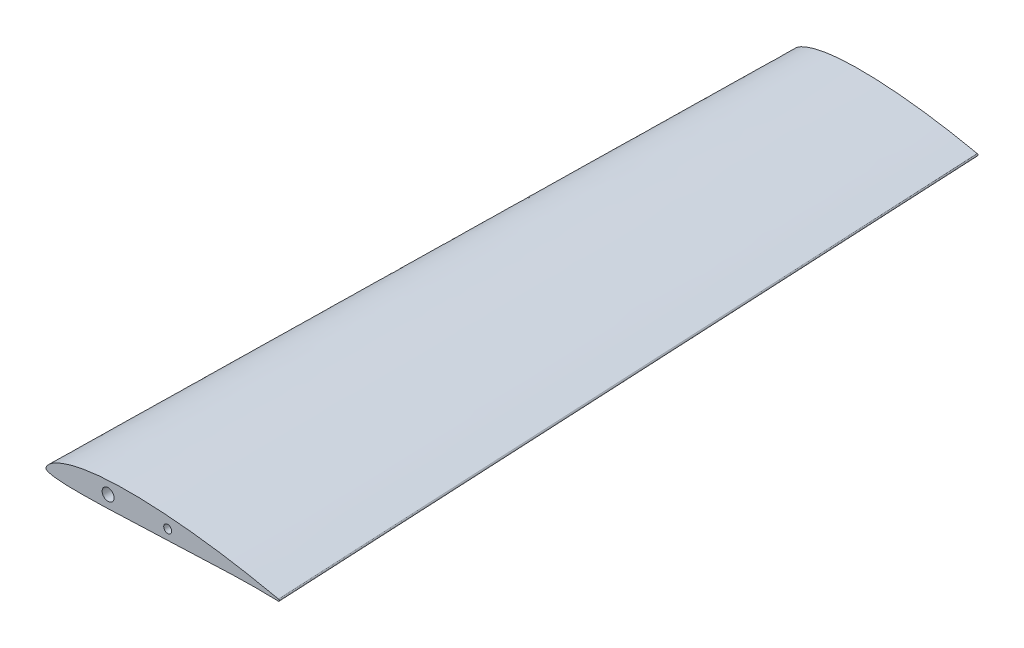
ISO-10303-21;
HEADER;
FILE_DESCRIPTION(('STEP AP214'),'2;1');
FILE_NAME('part.step','',(''),(''),'','','');
FILE_SCHEMA(('AUTOMOTIVE_DESIGN { 1 0 10303 214 1 1 1 1 }'));
ENDSEC;
DATA;
#1=APPLICATION_CONTEXT('core data for automotive mechanical design processes');
#2=APPLICATION_PROTOCOL_DEFINITION('international standard','automotive_design',2000,#1);
#3=PRODUCT_CONTEXT('',#1,'mechanical');
#4=PRODUCT('Part','Part','',(#3));
#5=PRODUCT_RELATED_PRODUCT_CATEGORY('part','',(#4));
#6=PRODUCT_DEFINITION_FORMATION('','',#4);
#7=PRODUCT_DEFINITION_CONTEXT('part definition',#1,'design');
#8=PRODUCT_DEFINITION('design','',#6,#7);
#9=PRODUCT_DEFINITION_SHAPE('','',#8);
#10=(LENGTH_UNIT() NAMED_UNIT(*) SI_UNIT(.MILLI.,.METRE.));
#11=(NAMED_UNIT(*) PLANE_ANGLE_UNIT() SI_UNIT($,.RADIAN.));
#12=(NAMED_UNIT(*) SI_UNIT($,.STERADIAN.) SOLID_ANGLE_UNIT());
#13=UNCERTAINTY_MEASURE_WITH_UNIT(LENGTH_MEASURE(1.E-05),#10,'distance_accuracy_value','');
#14=(GEOMETRIC_REPRESENTATION_CONTEXT(3) GLOBAL_UNCERTAINTY_ASSIGNED_CONTEXT((#13)) GLOBAL_UNIT_ASSIGNED_CONTEXT((#10,
#11,#12)) REPRESENTATION_CONTEXT('',''));
#15=CARTESIAN_POINT('',(0.,0.,0.));
#16=DIRECTION('',(0.,0.,1.));
#17=DIRECTION('',(1.,0.,0.));
#18=AXIS2_PLACEMENT_3D('',#15,#16,#17);
#19=CARTESIAN_POINT('',(13.4517460063052,2.2360292141561,-740.));
#20=DIRECTION('',(0.,0.,-1.));
#21=DIRECTION('',(1.,0.,0.));
#22=AXIS2_PLACEMENT_3D('',#19,#20,#21);
#23=PLANE('',#22);
#24=CARTESIAN_POINT('',(197.291595349815,2.86793277946552,-740.));
#25=CARTESIAN_POINT('',(195.312079724609,3.27334955577674,-740.));
#26=CARTESIAN_POINT('',(191.074144591571,4.14627716334438,-740.));
#27=CARTESIAN_POINT('',(184.318478618436,5.51626997247974,-740.));
#28=CARTESIAN_POINT('',(176.837510223753,6.97176864434472,-740.));
#29=CARTESIAN_POINT('',(168.752566914659,8.44637887681676,-740.));
#30=CARTESIAN_POINT('',(160.147793554918,9.89426193294475,-740.));
#31=CARTESIAN_POINT('',(151.105981215813,11.2786216238562,-740.));
#32=CARTESIAN_POINT('',(141.718962801258,12.5746341173652,-740.));
#33=CARTESIAN_POINT('',(132.082268781343,13.7529127900567,-740.));
#34=CARTESIAN_POINT('',(122.295761881316,14.7919564135995,-740.));
#35=CARTESIAN_POINT('',(112.458756480771,15.6615781652495,-740.));
#36=CARTESIAN_POINT('',(102.670664042973,16.3387879453908,-740.));
#37=CARTESIAN_POINT('',(93.0280749944796,16.8041132858275,-740.));
#38=CARTESIAN_POINT('',(83.6221091385133,17.0383550287883,-740.));
#39=CARTESIAN_POINT('',(74.5400080228458,17.0313313584405,-740.));
#40=CARTESIAN_POINT('',(65.8641711325625,16.7717363131863,-740.));
#41=CARTESIAN_POINT('',(57.6703172483418,16.2564676927047,-740.));
#42=CARTESIAN_POINT('',(50.0236676445992,15.4847749300983,-740.));
#43=CARTESIAN_POINT('',(42.9821543791823,14.4513259051911,-740.));
#44=CARTESIAN_POINT('',(36.5929817590931,13.2019314567816,-740.));
#45=CARTESIAN_POINT('',(30.8984099214197,11.7419931500888,-740.));
#46=CARTESIAN_POINT('',(25.93615424469,10.0880791762876,-740.));
#47=CARTESIAN_POINT('',(21.7230729086209,8.31360903600298,-740.));
#48=CARTESIAN_POINT('',(18.2789002988487,6.46559766044276,-740.));
#49=CARTESIAN_POINT('',(15.62819772296,4.62389921968104,-740.));
#50=CARTESIAN_POINT('',(13.7592710907508,2.78465935760903,-740.));
#51=CARTESIAN_POINT('',(12.7413729914095,1.1678335658997,-740.));
#52=CARTESIAN_POINT('',(12.3072927928413,-0.549235551179624,-740.));
#53=CARTESIAN_POINT('',(13.8612768515086,-1.69864203566333,-740.));
#54=CARTESIAN_POINT('',(16.101807562113,-2.27520943388668,-740.));
#55=CARTESIAN_POINT('',(19.4492611671672,-2.91777390324169,-740.));
#56=CARTESIAN_POINT('',(23.8087875319364,-3.32636967555989,-740.));
#57=CARTESIAN_POINT('',(29.1783989314235,-3.61916373660292,-740.));
#58=CARTESIAN_POINT('',(35.5023561922327,-3.7507043040599,-740.));
#59=CARTESIAN_POINT('',(42.7238269652506,-3.75126757238169,-740.));
#60=CARTESIAN_POINT('',(50.7702678647919,-3.6304211165848,-740.));
#61=CARTESIAN_POINT('',(59.5562442179012,-3.40154041694244,-740.));
#62=CARTESIAN_POINT('',(68.9854342669128,-3.09488549846827,-740.));
#63=CARTESIAN_POINT('',(78.9480811467622,-2.72722728644086,-740.));
#64=CARTESIAN_POINT('',(89.3285085947018,-2.30347692773391,-740.));
#65=CARTESIAN_POINT('',(100.00979181249,-1.8451067250394,-740.));
#66=CARTESIAN_POINT('',(110.872783341423,-1.35588828422285,-740.));
#67=CARTESIAN_POINT('',(121.797709464549,-0.858911186436468,-740.));
#68=CARTESIAN_POINT('',(132.659294998299,-0.37673803821542,-740.));
#69=CARTESIAN_POINT('',(143.329256663084,0.0612424511785985,-740.));
#70=CARTESIAN_POINT('',(153.676942484987,0.453434481292482,-740.));
#71=CARTESIAN_POINT('',(163.572760876274,0.766125592478284,-740.));
#72=CARTESIAN_POINT('',(172.88752896712,0.98246672953275,-740.));
#73=CARTESIAN_POINT('',(181.486359534792,1.08670782635015,-740.));
#74=CARTESIAN_POINT('',(189.245531160731,1.07766316980782,-740.));
#75=CARTESIAN_POINT('',(194.316954018626,0.97904099962605,-740.));
#76=CARTESIAN_POINT('',(196.811210155025,0.903211349424589,-740.));
#77=CARTESIAN_POINT('',(197.024916702042,0.896515167352307,-740.));
#78=B_SPLINE_CURVE_WITH_KNOTS('',3,(#24,#25,#26,#27,#28,#29,#30,#31,#32,#33,#34,#35,#36,#37,#38,
#39,#40,#41,#42,#43,#44,#45,#46,#47,#48,#49,#50,#51,#52,#53,#54,#55,#56,#57,#58,#59,#60,#61,#62,
#63,#64,#65,#66,#67,#68,#69,#70,#71,#72,#73,#74,#75,#76,#77),.UNSPECIFIED.,.F.,.F.,(4,1,1,1,1,1,
1,1,1,1,1,1,1,1,1,1,1,1,1,1,1,1,1,1,1,1,1,1,1,1,1,1,1,1,1,1,1,1,1,1,1,1,1,1,1,1,1,1,1,1,1,4),
(0.0380283592532992,0.0528763216078135,0.0699963828754541,0.0888022218683958,0.109061098247873,
0.130567425061989,0.153116971173523,0.176480775419818,0.200411415680187,0.22467357352927,
0.249017674403552,0.273197099739573,0.296987794138895,0.320168615199728,0.342541608750088,
0.363922282890659,0.384135181751947,0.403044445551104,0.42055410189389,0.436574577540293,
0.451009032189176,0.463855249744138,0.47509187234383,0.484672624467163,0.492592722285496,
0.49887863981433,0.503680966723728,0.506999829484217,0.510377645818406,0.516186564755205,
0.52448436696778,0.535271809634217,0.548506368525426,0.564092689522407,0.581895750586396,
0.601730211376006,0.623407354724284,0.646676813485776,0.671267833399773,0.696890216729438,
0.723252935121691,0.750070310983007,0.777040747125043,0.803862160527172,0.830208088720891,
0.855753570413101,0.880187506036329,0.90318552328119,0.924424801622873,0.943584131987353,
0.960334021796242,0.961903264898922),.UNSPECIFIED.);
#79=CARTESIAN_POINT('',(197.291595349815,2.86793277946552,-740.));
#80=VERTEX_POINT('',#79);
#81=CARTESIAN_POINT('',(197.024916702042,0.89651516735231,-740.));
#82=VERTEX_POINT('',#81);
#83=EDGE_CURVE('E47',#80,#82,#78,.T.);
#84=ORIENTED_EDGE('',*,*,#83,.F.);
#85=CARTESIAN_POINT('',(197.056234870489,1.89602463320301,-740.));
#86=DIRECTION('',(0.,0.,-1.));
#87=DIRECTION('',(-1.,0.,0.));
#88=AXIS2_PLACEMENT_3D('',#85,#86,#87);
#89=CIRCLE('',#88,0.999999999999998);
#90=EDGE_CURVE('E11',#80,#82,#89,.T.);
#91=ORIENTED_EDGE('',*,*,#90,.T.);
#92=EDGE_LOOP('',(#84,#91));
#93=FACE_BOUND('',#92,.T.);
#94=ADVANCED_FACE('F37',(#93),#23,.T.);
#95=CARTESIAN_POINT('',(233.846004199116,1.9809981067497,0.));
#96=DIRECTION('',(0.,0.,1.));
#97=DIRECTION('',(-1.,0.,0.));
#98=AXIS2_PLACEMENT_3D('',#95,#96,#97);
#99=PLANE('',#98);
#100=CARTESIAN_POINT('',(122.5,8.27788481283642,0.));
#101=DIRECTION('',(0.,0.,-1.));
#102=DIRECTION('',(-1.,0.,0.));
#103=AXIS2_PLACEMENT_3D('',#100,#101,#102);
#104=CIRCLE('',#103,4.);
#105=CARTESIAN_POINT('',(118.5,8.27788481283642,0.));
#106=VERTEX_POINT('',#105);
#107=EDGE_CURVE('E269',#106,#106,#104,.F.);
#108=ORIENTED_EDGE('',*,*,#107,.F.);
#109=EDGE_LOOP('',(#108));
#110=FACE_BOUND('',#109,.T.);
#111=CARTESIAN_POINT('',(62.5,8.27788481283643,0.));
#112=DIRECTION('',(0.,0.,-1.));
#113=DIRECTION('',(-1.,0.,0.));
#114=AXIS2_PLACEMENT_3D('',#111,#112,#113);
#115=CIRCLE('',#114,6.00000000000001);
#116=CARTESIAN_POINT('',(56.5,8.27788481283643,0.));
#117=VERTEX_POINT('',#116);
#118=EDGE_CURVE('E84',#117,#117,#115,.F.);
#119=ORIENTED_EDGE('',*,*,#118,.F.);
#120=EDGE_LOOP('',(#119));
#121=FACE_BOUND('',#120,.T.);
#122=CARTESIAN_POINT('',(233.846004199116,1.9809981067497,0.));
#123=DIRECTION('',(0.,0.,-1.));
#124=DIRECTION('',(-1.,0.,0.));
#125=AXIS2_PLACEMENT_3D('',#122,#123,#124);
#126=CIRCLE('',#125,1.);
#127=CARTESIAN_POINT('',(234.045372190915,2.96092279969609,0.));
#128=VERTEX_POINT('',#127);
#129=CARTESIAN_POINT('',(234.045372190915,1.0010734138033,0.));
#130=VERTEX_POINT('',#129);
#131=EDGE_CURVE('E68',#128,#130,#126,.T.);
#132=ORIENTED_EDGE('',*,*,#131,.F.);
#133=CARTESIAN_POINT('',(234.045372190915,2.96092279969609,0.));
#134=CARTESIAN_POINT('',(233.084471371881,3.15642034075415,0.));
#135=CARTESIAN_POINT('',(229.58356297286,3.87157090827319,0.));
#136=CARTESIAN_POINT('',(223.274395629888,5.17134515425177,0.));
#137=CARTESIAN_POINT('',(214.773098276905,6.89533747824343,0.));
#138=CARTESIAN_POINT('',(205.421887784745,8.71471082420948,0.));
#139=CARTESIAN_POINT('',(195.315708649586,10.5579736214296,0.));
#140=CARTESIAN_POINT('',(184.559741951098,12.367827448646,0.));
#141=CARTESIAN_POINT('',(173.257476528351,14.0982770697002,0.));
#142=CARTESIAN_POINT('',(161.523703511221,15.7182926942843,0.));
#143=CARTESIAN_POINT('',(149.477835987293,17.1911410430512,0.));
#144=CARTESIAN_POINT('',(137.244702363111,18.4899455805053,0.));
#145=CARTESIAN_POINT('',(124.948445613144,19.5769727781346,0.));
#146=CARTESIAN_POINT('',(112.713330066451,20.4234850113381,0.));
#147=CARTESIAN_POINT('',(100.660093756216,21.0051416947914,0.));
#148=CARTESIAN_POINT('',(88.9026364364503,21.2979438812058,0.));
#149=CARTESIAN_POINT('',(77.5500100418601,21.2891643007189,0.));
#150=CARTESIAN_POINT('',(66.7052139287931,20.9646705012658,0.));
#151=CARTESIAN_POINT('',(56.4628965730948,20.3205847323833,0.));
#152=CARTESIAN_POINT('',(46.9045845677836,19.3559687853959,0.));
#153=CARTESIAN_POINT('',(38.102692985165,18.0641575100364,0.));
#154=CARTESIAN_POINT('',(30.1162272090289,16.5024144547639,0.));
#155=CARTESIAN_POINT('',(22.9980124107399,14.6774915760678,0.));
#156=CARTESIAN_POINT('',(16.7951928134715,12.6100991128857,0.));
#157=CARTESIAN_POINT('',(11.5288411419299,10.3920114409848,0.));
#158=CARTESIAN_POINT('',(7.22362537819931,8.08199722435898,0.));
#159=CARTESIAN_POINT('',(3.91024715682811,5.77987417558057,0.));
#160=CARTESIAN_POINT('',(1.57408886505825,3.48082434952316,0.));
#161=CARTESIAN_POINT('',(0.301716239555787,1.45979211072129,0.));
#162=CARTESIAN_POINT('',(-0.240884010062589,-0.686544285271975,0.));
#163=CARTESIAN_POINT('',(1.70159606232904,-2.12330239215092,0.));
#164=CARTESIAN_POINT('',(4.50225945011166,-2.84401164176749,0.));
#165=CARTESIAN_POINT('',(8.68657645590246,-3.64721723120633,0.));
#166=CARTESIAN_POINT('',(14.1359844115289,-4.15796195017915,0.));
#167=CARTESIAN_POINT('',(20.8479986606477,-4.52395453088632,0.));
#168=CARTESIAN_POINT('',(28.7529452365513,-4.68838024539354,0.));
#169=CARTESIAN_POINT('',(37.7797837028233,-4.68908433671779,0.));
#170=CARTESIAN_POINT('',(47.8378348273489,-4.53802627357021,0.));
#171=CARTESIAN_POINT('',(58.8203052689232,-4.25192540622226,0.));
#172=CARTESIAN_POINT('',(70.6067928304393,-3.86860676586201,0.));
#173=CARTESIAN_POINT('',(83.0601014305525,-3.40903400899768,0.));
#174=CARTESIAN_POINT('',(96.0356357408246,-2.87934606912652,0.));
#175=CARTESIAN_POINT('',(109.387239763436,-2.30638332451764,0.));
#176=CARTESIAN_POINT('',(122.965979175003,-1.69486028240521,0.));
#177=CARTESIAN_POINT('',(136.622136829319,-1.07363891913129,0.));
#178=CARTESIAN_POINT('',(150.199118746901,-0.470922492762087,0.));
#179=CARTESIAN_POINT('',(163.536570828241,0.0765531102304625,0.));
#180=CARTESIAN_POINT('',(176.471178105942,0.566793139387138,0.));
#181=CARTESIAN_POINT('',(188.840951095307,0.957657020254261,0.));
#182=CARTESIAN_POINT('',(200.484411209042,1.22808343393371,0.));
#183=CARTESIAN_POINT('',(211.232949418717,1.35838479790393,0.));
#184=CARTESIAN_POINT('',(220.931913951134,1.34707897086306,0.));
#185=CARTESIAN_POINT('',(228.394859291241,1.20194970224318,0.));
#186=CARTESIAN_POINT('',(232.652829322058,1.05572626400647,0.));
#187=CARTESIAN_POINT('',(234.045372190915,1.0010734138033,0.));
#188=B_SPLINE_CURVE_WITH_KNOTS('',3,(#133,#134,#135,#136,#137,#138,#139,#140,#141,#142,#143,
#144,#145,#146,#147,#148,#149,#150,#151,#152,#153,#154,#155,#156,#157,#158,#159,#160,#161,#162,
#163,#164,#165,#166,#167,#168,#169,#170,#171,#172,#173,#174,#175,#176,#177,#178,#179,#180,#181,
#182,#183,#184,#185,#186,#187),.UNSPECIFIED.,.F.,.F.,(4,1,1,1,1,1,1,1,1,1,1,1,1,1,1,1,1,1,1,1,1,
1,1,1,1,1,1,1,1,1,1,1,1,1,1,1,1,1,1,1,1,1,1,1,1,1,1,1,1,1,1,1,4),(0.0319213311266676,
0.0376873555473671,0.0528763216078136,0.0699963828754541,0.0888022218683957,0.109061098247873,
0.130567425061989,0.153116971173523,0.176480775419818,0.200411415680187,0.22467357352927,
0.249017674403552,0.273197099739573,0.296987794138895,0.320168615199728,0.342541608750088,
0.363922282890659,0.384135181751947,0.403044445551104,0.42055410189389,0.436574577540293,
0.451009032189176,0.463855249744138,0.47509187234383,0.484672624467163,0.492592722285496,
0.49887863981433,0.503680966723728,0.506999829484217,0.510377645818406,0.516186564755205,
0.52448436696778,0.535271809634217,0.548506368525426,0.564092689522407,0.581895750586396,
0.601730211376006,0.623407354724284,0.646676813485776,0.671267833399773,0.696890216729438,
0.723252935121691,0.750070310983006,0.777040747125043,0.803862160527172,0.830208088720891,
0.8557535704131,0.880187506036329,0.90318552328119,0.924424801622873,0.943584131987353,
0.960334021796242,0.968546497754523),.UNSPECIFIED.);
#189=EDGE_CURVE('E72',#128,#130,#188,.T.);
#190=ORIENTED_EDGE('',*,*,#189,.T.);
#191=EDGE_LOOP('',(#132,#190));
#192=FACE_BOUND('',#191,.T.);
#193=ADVANCED_FACE('F83',(#110,#121,#192),#99,.T.);
#194=CARTESIAN_POINT('',(234.045372190915,2.96092279969609,0.));
#195=CARTESIAN_POINT('',(221.794113243882,2.9299261262859,-246.666666666667));
#196=CARTESIAN_POINT('',(209.542854296848,2.89892945287571,-493.333333333333));
#197=CARTESIAN_POINT('',(197.291595349815,2.86793277946552,-740.));
#198=CARTESIAN_POINT('',(229.124217712672,3.96214330092415,0.));
#199=CARTESIAN_POINT('',(217.216652694783,3.86297660124114,-246.666666666667));
#200=CARTESIAN_POINT('',(205.309087676894,3.76380990155814,-493.333333333333));
#201=CARTESIAN_POINT('',(193.401522659006,3.66464320187513,-740.));
#202=CARTESIAN_POINT('',(219.289488668589,6.00446265928543,0.));
#203=CARTESIAN_POINT('',(208.067881015589,5.76025759515323,-246.666666666667));
#204=CARTESIAN_POINT('',(196.84627336259,5.51605253102104,-493.333333333334));
#205=CARTESIAN_POINT('',(185.62466570959,5.27184746688884,-740.000000000001));
#206=CARTESIAN_POINT('',(204.504189842848,8.91417636466468,0.));
#207=CARTESIAN_POINT('',(194.313044592371,8.45433412200639,-246.666666666666));
#208=CARTESIAN_POINT('',(184.121899341894,7.99449187934809,-493.333333333333));
#209=CARTESIAN_POINT('',(173.930754091417,7.5346496366898,-739.999999999999));
#210=CARTESIAN_POINT('',(189.666116251643,11.5525186424466,0.));
#211=CARTESIAN_POINT('',(180.509967684622,10.8944810875847,-246.666666666667));
#212=CARTESIAN_POINT('',(171.353819117602,10.2364435327227,-493.333333333334));
#213=CARTESIAN_POINT('',(162.197670550581,9.57840597786068,-740.000000000001));
#214=CARTESIAN_POINT('',(174.777122160643,13.895515577838,0.));
#215=CARTESIAN_POINT('',(166.660741967789,13.0609226749031,-246.666666666666));
#216=CARTESIAN_POINT('',(158.544361774934,12.2263297719683,-493.333333333333));
#217=CARTESIAN_POINT('',(150.42798158208,11.3917368690334,-739.999999999999));
#218=CARTESIAN_POINT('',(159.844517179017,15.9522388161574,0.));
#219=CARTESIAN_POINT('',(152.772083493218,14.9621749701634,-246.666666666666));
#220=CARTESIAN_POINT('',(145.699649807419,13.9721111241694,-493.333333333333));
#221=CARTESIAN_POINT('',(138.62721612162,12.9820472781754,-739.999999999999));
#222=CARTESIAN_POINT('',(144.873762507699,17.720826017515,0.));
#223=CARTESIAN_POINT('',(138.848907734873,16.5961358115269,-246.666666666667));
#224=CARTESIAN_POINT('',(132.824052962048,15.4714456055389,-493.333333333335));
#225=CARTESIAN_POINT('',(126.799198189222,14.3467553995508,-740.000000000002));
#226=CARTESIAN_POINT('',(129.869167960459,19.188185322164,0.));
#227=CARTESIAN_POINT('',(124.895090272903,17.9498130708675,-246.666666666666));
#228=CARTESIAN_POINT('',(119.921012585347,16.7114408195711,-493.333333333332));
#229=CARTESIAN_POINT('',(114.946934897791,15.4730685682746,-739.999999999998));
#230=CARTESIAN_POINT('',(114.833953223789,20.3158295790169,0.));
#231=CARTESIAN_POINT('',(110.913597498735,18.9875537616487,-246.666666666667));
#232=CARTESIAN_POINT('',(106.99324177368,17.6592779442804,-493.333333333334));
#233=CARTESIAN_POINT('',(103.072886048625,16.3310021269122,-740.000000000001));
#234=CARTESIAN_POINT('',(102.28385720302,20.9401547563009,0.));
#235=CARTESIAN_POINT('',(99.2437073493346,19.5589200578988,-246.666666666666));
#236=CARTESIAN_POINT('',(96.2035574956495,18.1776853594967,-493.333333333332));
#237=CARTESIAN_POINT('',(93.1634076419644,16.7964506610946,-739.999999999998));
#238=CARTESIAN_POINT('',(92.235287250945,21.2159276013156,0.));
#239=CARTESIAN_POINT('',(89.9002759060238,19.8077930946634,-246.666666666667));
#240=CARTESIAN_POINT('',(87.5652645611026,18.3996585880111,-493.333333333335));
#241=CARTESIAN_POINT('',(85.2302532161814,16.9915240813589,-740.000000000002));
#242=CARTESIAN_POINT('',(84.6963374503799,21.3016410145387,0.));
#243=CARTESIAN_POINT('',(82.8905596492283,19.8818433678788,-246.666666666666));
#244=CARTESIAN_POINT('',(81.0847818480766,18.4620457212189,-493.333333333332));
#245=CARTESIAN_POINT('',(79.279004046925,17.042248074559,-739.999999999998));
#246=CARTESIAN_POINT('',(77.1567511942151,21.2538798701553,0.));
#247=CARTESIAN_POINT('',(75.8804480537026,19.8315679684863,-246.666666666667));
#248=CARTESIAN_POINT('',(74.6041449131902,18.4092560668173,-493.333333333334));
#249=CARTESIAN_POINT('',(73.3278417726777,16.9869441651482,-740.000000000001));
#250=CARTESIAN_POINT('',(69.6193700884628,21.0563611406712,0.));
#251=CARTESIAN_POINT('',(68.8726051366837,19.6419544320953,-246.666666666666));
#252=CARTESIAN_POINT('',(68.1258401849045,18.2275477235194,-493.333333333333));
#253=CARTESIAN_POINT('',(67.3790752331254,16.8131410149435,-739.999999999999));
#254=CARTESIAN_POINT('',(62.0879566014935,20.6908789768065,0.));
#255=CARTESIAN_POINT('',(61.8705322909847,19.2959933156077,-246.666666666667));
#256=CARTESIAN_POINT('',(61.6531079804759,17.9011076544088,-493.333333333334));
#257=CARTESIAN_POINT('',(61.4356836699672,16.5062219932099,-740.000000000001));
#258=CARTESIAN_POINT('',(54.5680163984297,20.133542612521,0.));
#259=CARTESIAN_POINT('',(54.8793852104563,18.7715170887923,-246.666666666666));
#260=CARTESIAN_POINT('',(55.190754022483,17.4094915650635,-493.333333333333));
#261=CARTESIAN_POINT('',(55.5021228345097,16.0474660413348,-739.999999999999));
#262=CARTESIAN_POINT('',(47.0675485653049,19.3520974879042,0.));
#263=CARTESIAN_POINT('',(47.9066320041519,18.0382148888877,-246.666666666667));
#264=CARTESIAN_POINT('',(48.7457154429989,16.7243322898712,-493.333333333334));
#265=CARTESIAN_POINT('',(49.5847988818459,15.4104496908548,-740.000000000001));
#266=CARTESIAN_POINT('',(40.8447167472665,18.4726988704588,0.));
#267=CARTESIAN_POINT('',(42.1219485825726,17.2148449702194,-246.666666666667));
#268=CARTESIAN_POINT('',(43.3991804178787,15.9569910699799,-493.333333333333));
#269=CARTESIAN_POINT('',(44.6764122531848,14.6991371697405,-740.));
#270=CARTESIAN_POINT('',(35.8908061290404,17.6178600571998,0.));
#271=CARTESIAN_POINT('',(37.5168963699704,16.4159041431136,-246.666666666667));
#272=CARTESIAN_POINT('',(39.1429866109004,15.2139482290273,-493.333333333333));
#273=CARTESIAN_POINT('',(40.7690768518304,14.011992314941,-740.));
#274=CARTESIAN_POINT('',(32.1906877466803,16.8932331544261,0.));
#275=CARTESIAN_POINT('',(34.07756508815,15.7386483351364,-246.666666666667));
#276=CARTESIAN_POINT('',(35.9644424296197,14.5840635158466,-493.333333333333));
#277=CARTESIAN_POINT('',(37.8513197710893,13.4294786965569,-740.));
#278=CARTESIAN_POINT('',(28.5105236951635,16.0725996667549,0.));
#279=CARTESIAN_POINT('',(30.6568040234792,14.9723006253558,-246.666666666667));
#280=CARTESIAN_POINT('',(32.8030843517948,13.8720015839567,-493.333333333333));
#281=CARTESIAN_POINT('',(34.9493646801105,12.7717025425577,-740.));
#282=CARTESIAN_POINT('',(24.8564349397307,15.1422590467274,0.));
#283=CARTESIAN_POINT('',(27.260529838683,14.1036114865409,-246.666666666667));
#284=CARTESIAN_POINT('',(29.6646247376354,13.0649639263544,-493.333333333334));
#285=CARTESIAN_POINT('',(32.0687196365877,12.0263163661679,-740.000000000001));
#286=CARTESIAN_POINT('',(21.237305525474,14.0830755436894,0.));
#287=CARTESIAN_POINT('',(23.8968877077042,13.1151721414945,-246.666666666667));
#288=CARTESIAN_POINT('',(26.5564698899344,12.1472687392997,-493.333333333333));
#289=CARTESIAN_POINT('',(29.2160520721646,11.1793653371049,-740.));
#290=CARTESIAN_POINT('',(17.6641802256163,12.8774023558106,0.));
#291=CARTESIAN_POINT('',(20.5761716109823,11.9906290721755,-246.666666666667));
#292=CARTESIAN_POINT('',(23.4881629963483,11.1038557885405,-493.333333333334));
#293=CARTESIAN_POINT('',(26.4001543817143,10.2170825049054,-740.));
#294=CARTESIAN_POINT('',(14.7347734185467,11.7389076168553,0.));
#295=CARTESIAN_POINT('',(17.8537992678466,10.9293460956912,-246.666666666667));
#296=CARTESIAN_POINT('',(20.9728251171465,10.1197845745271,-493.333333333334));
#297=CARTESIAN_POINT('',(24.0918509664465,9.31022305336293,-740.000000000001));
#298=CARTESIAN_POINT('',(12.4314177567035,10.7319662172645,0.));
#299=CARTESIAN_POINT('',(15.7134138974972,9.9908108308343,-246.666666666666));
#300=CARTESIAN_POINT('',(18.995410038291,9.24965544440409,-493.333333333333));
#301=CARTESIAN_POINT('',(22.2774061790847,8.50850005797388,-739.999999999999));
#302=CARTESIAN_POINT('',(10.7286429961644,9.9225469567882,0.));
#303=CARTESIAN_POINT('',(14.1311516778584,9.23660874912249,-246.666666666667));
#304=CARTESIAN_POINT('',(17.5336603595524,8.55067054145678,-493.333333333334));
#305=CARTESIAN_POINT('',(20.9361690412464,7.86473233379108,-740.000000000001));
#306=CARTESIAN_POINT('',(9.05479876366669,9.05455630166904,0.));
#307=CARTESIAN_POINT('',(12.5758972062479,8.42788204538471,-246.666666666666));
#308=CARTESIAN_POINT('',(16.096995648829,7.80120778910037,-493.333333333333));
#309=CARTESIAN_POINT('',(19.6180940914102,7.17453353281603,-739.999999999999));
#310=CARTESIAN_POINT('',(7.4186820914979,8.11726419274678,0.));
#311=CARTESIAN_POINT('',(11.0557604027988,7.55482609866555,-246.666666666667));
#312=CARTESIAN_POINT('',(14.6928387140996,6.99238800458432,-493.333333333333));
#313=CARTESIAN_POINT('',(18.3299170254005,6.4299499105031,-740.));
#314=CARTESIAN_POINT('',(5.82711746158076,7.10576804768862,0.));
#315=CARTESIAN_POINT('',(9.57714221382747,6.61278631141867,-246.666666666667));
#316=CARTESIAN_POINT('',(13.3271669660742,6.11980457514873,-493.333333333333));
#317=CARTESIAN_POINT('',(17.0771917183209,5.62682283887878,-740.));
#318=CARTESIAN_POINT('',(4.55587480996735,6.18102180044649,0.));
#319=CARTESIAN_POINT('',(8.3964054049417,5.75149964651408,-246.666666666666));
#320=CARTESIAN_POINT('',(12.2369359999161,5.32197749258167,-493.333333333333));
#321=CARTESIAN_POINT('',(16.0774665948904,4.89245533864927,-739.999999999999));
#322=CARTESIAN_POINT('',(3.5867143571928,5.38034497942647,0.));
#323=CARTESIAN_POINT('',(7.49629854884602,5.00601878575468,-246.666666666667));
#324=CARTESIAN_POINT('',(11.4058827404992,4.63169259208288,-493.333333333334));
#325=CARTESIAN_POINT('',(15.3154669321525,4.25736639841109,-740.000000000001));
#326=CARTESIAN_POINT('',(2.8878970503571,4.74736857183619,0.));
#327=CARTESIAN_POINT('',(6.84734805614401,4.41673716853867,-246.666666666667));
#328=CARTESIAN_POINT('',(10.8067990619309,4.08610576524114,-493.333333333333));
#329=CARTESIAN_POINT('',(14.7662500677178,3.75547436194362,-740.));
#330=CARTESIAN_POINT('',(2.22427170138093,4.0775313910847,0.));
#331=CARTESIAN_POINT('',(6.23118229709822,3.79319757459415,-246.666666666667));
#332=CARTESIAN_POINT('',(10.2380928928155,3.50886375810359,-493.333333333333));
#333=CARTESIAN_POINT('',(14.2450034885328,3.22452994161304,-740.));
#334=CARTESIAN_POINT('',(1.60563594314412,3.3652700022986,0.));
#335=CARTESIAN_POINT('',(5.6568264193525,3.13034201693223,-246.666666666667));
#336=CARTESIAN_POINT('',(9.70801689556087,2.89541403156586,-493.333333333333));
#337=CARTESIAN_POINT('',(13.7592073717692,2.66048604619949,-740.));
#338=CARTESIAN_POINT('',(1.04180385726185,2.6095102189365,0.));
#339=CARTESIAN_POINT('',(5.13348719688817,2.42708631341766,-246.666666666667));
#340=CARTESIAN_POINT('',(9.22517053651448,2.24466240789882,-493.333333333333));
#341=CARTESIAN_POINT('',(13.3168538761408,2.06223850237998,-740.));
#342=CARTESIAN_POINT('',(0.562909267374019,1.79414922417329,0.));
#343=CARTESIAN_POINT('',(4.68921649286999,1.66844719855819,-246.666666666667));
#344=CARTESIAN_POINT('',(8.81552371836596,1.54274517294308,-493.333333333334));
#345=CARTESIAN_POINT('',(12.9418309438619,1.41704314732798,-740.));
#346=CARTESIAN_POINT('',(0.193652953403498,0.92755892740975,0.));
#347=CARTESIAN_POINT('',(4.34642818744044,0.862638406533515,-246.666666666667));
#348=CARTESIAN_POINT('',(8.49920342147738,0.797717885657279,-493.333333333333));
#349=CARTESIAN_POINT('',(12.6519786555143,0.732797364781044,-740.));
#350=CARTESIAN_POINT('',(0.0318424753081781,0.313216277061952,0.));
#351=CARTESIAN_POINT('',(4.19638166709598,0.29139175691789,-246.666666666667));
#352=CARTESIAN_POINT('',(8.36092085888377,0.269567236773827,-493.333333333333));
#353=CARTESIAN_POINT('',(12.5254600506716,0.247742716629765,-740.));
#354=CARTESIAN_POINT('',(0.0199937833034883,-0.000753236264200462,0.));
#355=CARTESIAN_POINT('',(4.18533516441636,-0.000501798028216508,-246.666666666667));
#356=CARTESIAN_POINT('',(8.35067654552923,-0.000250359792232553,-493.333333333333));
#357=CARTESIAN_POINT('',(12.5160179266421,1.07844375138823E-06,-740.));
#358=CARTESIAN_POINT('',(0.0142152575959383,-0.153874011403267,0.));
#359=CARTESIAN_POINT('',(4.17994786093278,-0.142856279894793,-246.666666666667));
#360=CARTESIAN_POINT('',(8.34568046426963,-0.131838548386318,-493.333333333333));
#361=CARTESIAN_POINT('',(12.5114130676065,-0.120820816877844,-740.));
#362=CARTESIAN_POINT('',(0.0359673568880309,-0.464039093319274,0.));
#363=CARTESIAN_POINT('',(4.20000320752688,-0.431190535425803,-246.666666666666));
#364=CARTESIAN_POINT('',(8.36403905816573,-0.398341977532332,-493.333333333333));
#365=CARTESIAN_POINT('',(12.5280749088046,-0.365493419638861,-739.999999999999));
#366=CARTESIAN_POINT('',(0.237724211731499,-0.885517884327524,0.));
#367=CARTESIAN_POINT('',(4.38655035257089,-0.823458616982183,-246.666666666667));
#368=CARTESIAN_POINT('',(8.53537649341029,-0.761399349636841,-493.333333333334));
#369=CARTESIAN_POINT('',(12.6842026342497,-0.6993400822915,-740.000000000001));
#370=CARTESIAN_POINT('',(0.551681322370607,-1.22548061071557,0.));
#371=CARTESIAN_POINT('',(4.67772362539405,-1.14021408291504,-246.666666666666));
#372=CARTESIAN_POINT('',(8.80376592841749,-1.0549475551145,-493.333333333333));
#373=CARTESIAN_POINT('',(12.9298082314409,-0.969681027313965,-739.999999999999));
#374=CARTESIAN_POINT('',(0.915639378563885,-1.5073957730364,0.));
#375=CARTESIAN_POINT('',(5.01557893957047,-1.40296678521357,-246.666666666667));
#376=CARTESIAN_POINT('',(9.11551850057705,-1.29853779739074,-493.333333333334));
#377=CARTESIAN_POINT('',(13.2154580615836,-1.19410880956791,-740.000000000001));
#378=CARTESIAN_POINT('',(1.30891527451758,-1.74658849655118,0.));
#379=CARTESIAN_POINT('',(5.38084923727801,-1.62590281208278,-246.666666666666));
#380=CARTESIAN_POINT('',(9.45278320003844,-1.50521712761439,-493.333333333333));
#381=CARTESIAN_POINT('',(13.5247171627989,-1.38453144314599,-739.999999999999));
#382=CARTESIAN_POINT('',(1.85317855770432,-2.02898626604004,0.));
#383=CARTESIAN_POINT('',(5.88645086631643,-1.88916418760633,-246.666666666667));
#384=CARTESIAN_POINT('',(9.91972317492854,-1.74934210917262,-493.333333333334));
#385=CARTESIAN_POINT('',(13.9529954835407,-1.60952003073891,-740.000000000001));
#386=CARTESIAN_POINT('',(2.56619239830922,-2.313643727262,0.));
#387=CARTESIAN_POINT('',(6.54886484139292,-2.15490724110727,-246.666666666666));
#388=CARTESIAN_POINT('',(10.5315372844766,-1.99617075495253,-493.333333333333));
#389=CARTESIAN_POINT('',(14.5142097275603,-1.83743426879779,-739.999999999999));
#390=CARTESIAN_POINT('',(3.45087243918399,-2.56615594789257,0.));
#391=CARTESIAN_POINT('',(7.37096165768562,-2.39091432969721,-246.666666666667));
#392=CARTESIAN_POINT('',(11.2910508761872,-2.21567271150185,-493.333333333334));
#393=CARTESIAN_POINT('',(15.2111400946889,-2.04043109330649,-740.000000000001));
#394=CARTESIAN_POINT('',(4.34688207034917,-2.772877952523,0.));
#395=CARTESIAN_POINT('',(8.20382972399394,-2.58354678890648,-246.666666666667));
#396=CARTESIAN_POINT('',(12.0607773776387,-2.39421562528995,-493.333333333334));
#397=CARTESIAN_POINT('',(15.9177250312835,-2.20488446167343,-740.000000000001));
#398=CARTESIAN_POINT('',(5.24523779360061,-2.96874344983617,0.));
#399=CARTESIAN_POINT('',(9.0389112781235,-2.76590892546059,-246.666666666666));
#400=CARTESIAN_POINT('',(12.8325847626464,-2.563074401085,-493.333333333332));
#401=CARTESIAN_POINT('',(16.6262582471693,-2.36023987670942,-739.999999999998));
#402=CARTESIAN_POINT('',(6.14706342725053,-3.14838189721164,0.));
#403=CARTESIAN_POINT('',(9.87718416780124,-2.93334415492068,-246.666666666667));
#404=CARTESIAN_POINT('',(13.607304908352,-2.71830641262973,-493.333333333335));
#405=CARTESIAN_POINT('',(17.3374256489027,-2.50326867033877,-740.000000000002));
#406=CARTESIAN_POINT('',(7.05161657644451,-3.31356226461709,0.));
#407=CARTESIAN_POINT('',(10.7179884836224,-3.08736413751111,-246.666666666666));
#408=CARTESIAN_POINT('',(14.3843603908003,-2.86116601040512,-493.333333333333));
#409=CARTESIAN_POINT('',(18.0507322979782,-2.63496788329913,-739.999999999999));
#410=CARTESIAN_POINT('',(7.95897047661617,-3.46288988461933,0.));
#411=CARTESIAN_POINT('',(11.5613824774374,-3.22673148489657,-246.666666666666));
#412=CARTESIAN_POINT('',(15.1637944782587,-2.99057308517382,-493.333333333333));
#413=CARTESIAN_POINT('',(18.7662064790799,-2.75441468545107,-739.999999999999));
#414=CARTESIAN_POINT('',(8.86884868655473,-3.5959273601195,0.));
#415=CARTESIAN_POINT('',(12.4071139659396,-3.35104323541834,-246.666666666667));
#416=CARTESIAN_POINT('',(15.9453792453244,-3.10615911071717,-493.333333333334));
#417=CARTESIAN_POINT('',(19.4836445247093,-2.861274986016,-740.000000000001));
#418=CARTESIAN_POINT('',(9.7808955592345,-3.71336727108399,0.));
#419=CARTESIAN_POINT('',(13.2548689802484,-3.46081803538006,-246.666666666667));
#420=CARTESIAN_POINT('',(16.7288424012624,-3.20826879967613,-493.333333333333));
#421=CARTESIAN_POINT('',(20.2028158222763,-2.9557195639722,-740.));
#422=CARTESIAN_POINT('',(10.6945678885811,-3.81730622605102,0.));
#423=CARTESIAN_POINT('',(14.1041387864711,-3.55803822522462,-246.666666666667));
#424=CARTESIAN_POINT('',(17.513709684361,-3.29877022439822,-493.333333333333));
#425=CARTESIAN_POINT('',(20.923280582251,-3.03950222357181,-740.));
#426=CARTESIAN_POINT('',(11.9144980932842,-3.94037800592294,0.));
#427=CARTESIAN_POINT('',(15.238087374854,-3.67316463009611,-246.666666666667));
#428=CARTESIAN_POINT('',(18.5616766564237,-3.40595125426928,-493.333333333334));
#429=CARTESIAN_POINT('',(21.8852659379934,-3.13873787844244,-740.));
#430=CARTESIAN_POINT('',(13.4417560521711,-4.06934189292102,0.));
#431=CARTESIAN_POINT('',(16.657715788385,-3.79378047884369,-246.666666666667));
#432=CARTESIAN_POINT('',(19.873675524599,-3.51821906476636,-493.333333333334));
#433=CARTESIAN_POINT('',(23.0896352608129,-3.24265765068903,-740.));
#434=CARTESIAN_POINT('',(15.276281865654,-4.20106557488753,0.));
#435=CARTESIAN_POINT('',(18.3629613617094,-3.91683048661227,-246.666666666667));
#436=CARTESIAN_POINT('',(21.4496408577647,-3.63259539833702,-493.333333333333));
#437=CARTESIAN_POINT('',(24.5363203538201,-3.34836031006176,-740.));
#438=CARTESIAN_POINT('',(17.1121720361553,-4.31303914120166,0.));
#439=CARTESIAN_POINT('',(20.0694483448689,-4.02161584374038,-246.666666666667));
#440=CARTESIAN_POINT('',(23.0267246535826,-3.7301925462791,-493.333333333333));
#441=CARTESIAN_POINT('',(25.9840009622962,-3.43876924881783,-740.));
#442=CARTESIAN_POINT('',(18.949148135561,-4.40637490509989,0.));
#443=CARTESIAN_POINT('',(21.7769273764237,-4.10905066750999,-246.666666666667));
#444=CARTESIAN_POINT('',(24.6047066172863,-3.8117264299201,-493.333333333334));
#445=CARTESIAN_POINT('',(27.4324858581489,-3.5144021923302,-740.));
#446=CARTESIAN_POINT('',(20.7869443295675,-4.48294284133713,0.));
#447=CARTESIAN_POINT('',(23.4851486750182,-4.18092031537875,-246.666666666666));
#448=CARTESIAN_POINT('',(26.1833530204689,-3.87889778942037,-493.333333333333));
#449=CARTESIAN_POINT('',(28.8815573659195,-3.57687526346199,-739.999999999999));
#450=CARTESIAN_POINT('',(22.6253574095946,-4.54425162617185,0.));
#451=CARTESIAN_POINT('',(25.1939247255943,-4.23856615262723,-246.666666666666));
#452=CARTESIAN_POINT('',(27.7624920415941,-3.93288067908261,-493.333333333333));
#453=CARTESIAN_POINT('',(30.3310593575939,-3.62719520553799,-739.999999999999));
#454=CARTESIAN_POINT('',(24.4642141527915,-4.59203076031432,0.));
#455=CARTESIAN_POINT('',(26.9030955490661,-4.28363922229777,-246.666666666667));
#456=CARTESIAN_POINT('',(29.3419769453408,-3.97524768428122,-493.333333333334));
#457=CARTESIAN_POINT('',(31.7808583416154,-3.66685614626467,-740.000000000001));
#458=CARTESIAN_POINT('',(26.3033831411715,-4.62797843238423,0.));
#459=CARTESIAN_POINT('',(28.61253631686,-4.31763601914623,-246.666666666667));
#460=CARTESIAN_POINT('',(30.9216894925484,-4.00729360590823,-493.333333333333));
#461=CARTESIAN_POINT('',(33.2308426682368,-3.69695119267023,-740.));
#462=CARTESIAN_POINT('',(28.7558915960728,-4.6622850033652,0.));
#463=CARTESIAN_POINT('',(30.8920312402584,-4.35025898411192,-246.666666666666));
#464=CARTESIAN_POINT('',(33.0281708844441,-4.03823296485863,-493.333333333333));
#465=CARTESIAN_POINT('',(35.1643105286296,-3.72620694560535,-739.999999999999));
#466=CARTESIAN_POINT('',(31.8218737863967,-4.68427218084544,0.));
#467=CARTESIAN_POINT('',(33.7416708045934,-4.37148985858224,-246.666666666667));
#468=CARTESIAN_POINT('',(35.66146782279,-4.05870753631905,-493.333333333335));
#469=CARTESIAN_POINT('',(37.5812648409866,-3.74592521405585,-740.000000000002));
#470=CARTESIAN_POINT('',(35.5012952806348,-4.68203508209456,0.));
#471=CARTESIAN_POINT('',(37.1613882733993,-4.37037785707011,-246.666666666666));
#472=CARTESIAN_POINT('',(38.8214812661638,-4.05872063204566,-493.333333333332));
#473=CARTESIAN_POINT('',(40.4815742589283,-3.74706340702121,-739.999999999998));
#474=CARTESIAN_POINT('',(39.1807714029445,-4.65612656472165,0.));
#475=CARTESIAN_POINT('',(40.5810819666255,-4.34714229155265,-246.666666666667));
#476=CARTESIAN_POINT('',(41.9813925303064,-4.03815801838365,-493.333333333334));
#477=CARTESIAN_POINT('',(43.3817030939874,-3.72917374521464,-740.000000000001));
#478=CARTESIAN_POINT('',(42.8601908532669,-4.61031348577489,0.));
#479=CARTESIAN_POINT('',(44.0006528609677,-4.30539370290108,-246.666666666666));
#480=CARTESIAN_POINT('',(45.1411148686686,-4.00047392002727,-493.333333333333));
#481=CARTESIAN_POINT('',(46.2815768763695,-3.69555413715346,-739.999999999999));
#482=CARTESIAN_POINT('',(46.5394797110927,-4.54694215211841,0.));
#483=CARTESIAN_POINT('',(47.4200360519736,-4.24727412495219,-246.666666666667));
#484=CARTESIAN_POINT('',(48.3005923928545,-3.94760609778597,-493.333333333334));
#485=CARTESIAN_POINT('',(49.1811487337354,-3.64793807061976,-740.000000000001));
#486=CARTESIAN_POINT('',(50.2186038123835,-4.46878485759634,0.));
#487=CARTESIAN_POINT('',(50.8392031569034,-4.17534208460682,-246.666666666666));
#488=CARTESIAN_POINT('',(51.4598025014234,-3.8818993116173,-493.333333333333));
#489=CARTESIAN_POINT('',(52.0804018459433,-3.58845653862778,-739.999999999999));
#490=CARTESIAN_POINT('',(53.897552720353,-4.37810932020192,0.));
#491=CARTESIAN_POINT('',(54.2581492896239,-4.09173208061122,-246.666666666667));
#492=CARTESIAN_POINT('',(54.6187458588948,-3.80535484102053,-493.333333333334));
#493=CARTESIAN_POINT('',(54.9793424281657,-3.51897760142983,-740.));
#494=CARTESIAN_POINT('',(57.5763306008981,-4.27696919339671,0.));
#495=CARTESIAN_POINT('',(57.6768810554423,-3.99828967186006,-246.666666666666));
#496=CARTESIAN_POINT('',(57.7774315099864,-3.71961015032342,-493.333333333333));
#497=CARTESIAN_POINT('',(57.8779819645306,-3.44093062878678,-739.999999999999));
#498=CARTESIAN_POINT('',(61.2549708266537,-4.16775560683602,0.));
#499=CARTESIAN_POINT('',(61.0954347509132,-3.89728863817163,-246.666666666667));
#500=CARTESIAN_POINT('',(60.9358986751728,-3.62682166950724,-493.333333333333));
#501=CARTESIAN_POINT('',(60.7763625994323,-3.35635470084284,-740.));
#502=CARTESIAN_POINT('',(66.1596498311152,-4.01275543499381,0.));
#503=CARTESIAN_POINT('',(65.6532842920463,-3.75383309818565,-246.666666666667));
#504=CARTESIAN_POINT('',(65.1469187529773,-3.49491076137749,-493.333333333334));
#505=CARTESIAN_POINT('',(64.6405532139083,-3.23598842456933,-740.000000000001));
#506=CARTESIAN_POINT('',(72.290191406237,-3.80383230120044,0.));
#507=CARTESIAN_POINT('',(71.3502110593039,-3.56034122452487,-246.666666666666));
#508=CARTESIAN_POINT('',(70.4102307123707,-3.3168501478493,-493.333333333333));
#509=CARTESIAN_POINT('',(69.4702503654376,-3.07335907117373,-739.999999999999));
#510=CARTESIAN_POINT('',(79.6464065720465,-3.53455768268339,0.));
#511=CARTESIAN_POINT('',(78.1860015105651,-3.3108334834292,-246.666666666667));
#512=CARTESIAN_POINT('',(76.7255964490837,-3.08710928417501,-493.333333333334));
#513=CARTESIAN_POINT('',(75.2651913876023,-2.86338508492082,-740.000000000001));
#514=CARTESIAN_POINT('',(87.002100357213,-3.24759625903178,0.));
#515=CARTESIAN_POINT('',(85.0212335355745,-3.04494308801028,-246.666666666667));
#516=CARTESIAN_POINT('',(83.0403667139361,-2.84228991698879,-493.333333333333));
#517=CARTESIAN_POINT('',(81.0594998922977,-2.63963674596729,-740.));
#518=CARTESIAN_POINT('',(94.3572888159045,-2.94630162334225,0.));
#519=CARTESIAN_POINT('',(91.8559531733054,-2.76555615850629,-246.666666666667));
#520=CARTESIAN_POINT('',(89.3546175307062,-2.58481069367033,-493.333333333333));
#521=CARTESIAN_POINT('',(86.853281888107,-2.40406522883437,-740.));
#522=CARTESIAN_POINT('',(101.712091601617,-2.63589152375517,0.));
#523=CARTESIAN_POINT('',(98.6903105699315,-2.47752828623141,-246.666666666667));
#524=CARTESIAN_POINT('',(95.6685295382457,-2.31916504870765,-493.333333333334));
#525=CARTESIAN_POINT('',(92.6467485065598,-2.16080181118388,-740.));
#526=CARTESIAN_POINT('',(109.066455792805,-2.31714296666147,0.));
#527=CARTESIAN_POINT('',(105.524307744862,-2.18184068938701,-246.666666666666));
#528=CARTESIAN_POINT('',(101.982159696919,-2.04653841211256,-493.333333333333));
#529=CARTESIAN_POINT('',(98.4400116489761,-1.91123613483811,-739.999999999999));
#530=CARTESIAN_POINT('',(116.420283112858,-1.98979981304174,0.));
#531=CARTESIAN_POINT('',(112.357887744392,-1.87812247801659,-246.666666666667));
#532=CARTESIAN_POINT('',(108.295492375926,-1.76644514299143,-493.333333333334));
#533=CARTESIAN_POINT('',(104.233097007459,-1.65476780796627,-740.000000000001));
#534=CARTESIAN_POINT('',(123.773651622598,-1.65749060435572,0.));
#535=CARTESIAN_POINT('',(119.191154044871,-1.56954249535267,-246.666666666666));
#536=CARTESIAN_POINT('',(114.608656467145,-1.48159438634962,-493.333333333333));
#537=CARTESIAN_POINT('',(110.026158889418,-1.39364627734657,-739.999999999999));
#538=CARTESIAN_POINT('',(131.126645026389,-1.32379225153022,0.));
#539=CARTESIAN_POINT('',(126.024225412307,-1.2594620739518,-246.666666666667));
#540=CARTESIAN_POINT('',(120.921805798226,-1.19513189637338,-493.333333333334));
#541=CARTESIAN_POINT('',(115.819386184145,-1.13080171879497,-740.000000000002));
#542=CARTESIAN_POINT('',(138.479334359586,-0.99194193562999,0.));
#543=CARTESIAN_POINT('',(132.857206931368,-0.950845771890139,-246.666666666666));
#544=CARTESIAN_POINT('',(127.23507950315,-0.909749608150288,-493.333333333332));
#545=CARTESIAN_POINT('',(121.612952074933,-0.868653444410438,-739.999999999998));
#546=CARTESIAN_POINT('',(145.83179802719,-0.665438542581365,0.));
#547=CARTESIAN_POINT('',(139.690208451102,-0.646901850522544,-246.666666666667));
#548=CARTESIAN_POINT('',(133.548618875013,-0.628365158463724,-493.333333333334));
#549=CARTESIAN_POINT('',(127.407029298925,-0.609828466404904,-740.000000000002));
#550=CARTESIAN_POINT('',(153.184192612751,-0.349650301791006,0.));
#551=CARTESIAN_POINT('',(146.523407968177,-0.35236015356393,-246.666666666666));
#552=CARTESIAN_POINT('',(139.862623323604,-0.355070005336853,-493.333333333332));
#553=CARTESIAN_POINT('',(133.20183867903,-0.357779857109777,-739.999999999999));
#554=CARTESIAN_POINT('',(160.53655588663,-0.0479049490519924,0.));
#555=CARTESIAN_POINT('',(153.356899161628,-0.0708134202825702,-246.666666666667));
#556=CARTESIAN_POINT('',(146.177242436626,-0.0937218915131481,-493.333333333334));
#557=CARTESIAN_POINT('',(138.997585711624,-0.116630362743726,-740.000000000001));
#558=CARTESIAN_POINT('',(167.888717681594,0.241749992279115,0.));
#559=CARTESIAN_POINT('',(160.19057132193,0.199586333337043,-246.666666666667));
#560=CARTESIAN_POINT('',(152.492424962265,0.15742267439497,-493.333333333333));
#561=CARTESIAN_POINT('',(144.7942786026,0.115259015452898,-740.));
#562=CARTESIAN_POINT('',(175.240746872379,0.514576161062962,0.));
#563=CARTESIAN_POINT('',(167.024499092672,0.454842138412079,-246.666666666667));
#564=CARTESIAN_POINT('',(158.808251312965,0.395108115761196,-493.333333333334));
#565=CARTESIAN_POINT('',(150.592003533258,0.335374093110314,-740.));
#566=CARTESIAN_POINT('',(182.592864126057,0.761772088375299,0.));
#567=CARTESIAN_POINT('',(173.8589274552,0.687410246657396,-246.666666666667));
#568=CARTESIAN_POINT('',(165.124990784343,0.613048404939492,-493.333333333333));
#569=CARTESIAN_POINT('',(156.391054113485,0.538686563221589,-740.));
#570=CARTESIAN_POINT('',(192.395757398099,1.04887975411827,0.));
#571=CARTESIAN_POINT('',(182.972199689562,0.959005751289306,-246.666666666666));
#572=CARTESIAN_POINT('',(173.548641981025,0.86913174846034,-493.333333333333));
#573=CARTESIAN_POINT('',(164.125084272487,0.779257745631374,-739.999999999999));
#574=CARTESIAN_POINT('',(202.19882588453,1.25909794964984,0.));
#575=CARTESIAN_POINT('',(192.086667685837,1.16003123640579,-246.666666666667));
#576=CARTESIAN_POINT('',(181.974509487143,1.06096452316174,-493.333333333334));
#577=CARTESIAN_POINT('',(171.862351288449,0.961897809917695,-740.));
#578=CARTESIAN_POINT('',(212.001317319028,1.35131508745861,0.));
#579=CARTESIAN_POINT('',(201.201852965548,1.25587186326225,-246.666666666667));
#580=CARTESIAN_POINT('',(190.402388612068,1.16042863906588,-493.333333333333));
#581=CARTESIAN_POINT('',(179.602924258588,1.06498541486952,-740.));
#582=CARTESIAN_POINT('',(219.35230556831,1.34963153740118,0.));
#583=CARTESIAN_POINT('',(208.038114257638,1.26256877511157,-246.666666666667));
#584=CARTESIAN_POINT('',(196.723922946966,1.17550601282196,-493.333333333333));
#585=CARTESIAN_POINT('',(185.409731636294,1.08844325053235,-740.));
#586=CARTESIAN_POINT('',(226.701400919272,1.24688227140644,0.));
#587=CARTESIAN_POINT('',(214.873481058552,1.17924204085774,-246.666666666667));
#588=CARTESIAN_POINT('',(203.045561197831,1.11160181030905,-493.333333333333));
#589=CARTESIAN_POINT('',(191.217641337111,1.04396157976036,-740.));
#590=CARTESIAN_POINT('',(231.598094009792,1.09712124890385,0.));
#591=CARTESIAN_POINT('',(219.428514616519,1.05046854467749,-246.666666666667));
#592=CARTESIAN_POINT('',(207.258935223246,1.00381584045113,-493.333333333333));
#593=CARTESIAN_POINT('',(195.089355829972,0.957163136224766,-740.));
#594=CARTESIAN_POINT('',(234.045372190915,1.00107341380329,0.));
#595=CARTESIAN_POINT('',(221.705220361291,0.966220664986299,-246.666666666667));
#596=CARTESIAN_POINT('',(209.365068531666,0.931367916169304,-493.333333333333));
#597=CARTESIAN_POINT('',(197.024916702042,0.89651516735231,-740.));
#598=B_SPLINE_SURFACE_WITH_KNOTS('',3,3,((#194,#195,#196,#197),(#198,#199,#200,#201),(#202,#203,
#204,#205),(#206,#207,#208,#209),(#210,#211,#212,#213),(#214,#215,#216,#217),(#218,#219,#220,
#221),(#222,#223,#224,#225),(#226,#227,#228,#229),(#230,#231,#232,#233),(#234,#235,#236,#237),
(#238,#239,#240,#241),(#242,#243,#244,#245),(#246,#247,#248,#249),(#250,#251,#252,#253),(#254,
#255,#256,#257),(#258,#259,#260,#261),(#262,#263,#264,#265),(#266,#267,#268,#269),(#270,#271,
#272,#273),(#274,#275,#276,#277),(#278,#279,#280,#281),(#282,#283,#284,#285),(#286,#287,#288,
#289),(#290,#291,#292,#293),(#294,#295,#296,#297),(#298,#299,#300,#301),(#302,#303,#304,#305),
(#306,#307,#308,#309),(#310,#311,#312,#313),(#314,#315,#316,#317),(#318,#319,#320,#321),(#322,
#323,#324,#325),(#326,#327,#328,#329),(#330,#331,#332,#333),(#334,#335,#336,#337),(#338,#339,
#340,#341),(#342,#343,#344,#345),(#346,#347,#348,#349),(#350,#351,#352,#353),(#354,#355,#356,
#357),(#358,#359,#360,#361),(#362,#363,#364,#365),(#366,#367,#368,#369),(#370,#371,#372,#373),
(#374,#375,#376,#377),(#378,#379,#380,#381),(#382,#383,#384,#385),(#386,#387,#388,#389),(#390,
#391,#392,#393),(#394,#395,#396,#397),(#398,#399,#400,#401),(#402,#403,#404,#405),(#406,#407,
#408,#409),(#410,#411,#412,#413),(#414,#415,#416,#417),(#418,#419,#420,#421),(#422,#423,#424,
#425),(#426,#427,#428,#429),(#430,#431,#432,#433),(#434,#435,#436,#437),(#438,#439,#440,#441),
(#442,#443,#444,#445),(#446,#447,#448,#449),(#450,#451,#452,#453),(#454,#455,#456,#457),(#458,
#459,#460,#461),(#462,#463,#464,#465),(#466,#467,#468,#469),(#470,#471,#472,#473),(#474,#475,
#476,#477),(#478,#479,#480,#481),(#482,#483,#484,#485),(#486,#487,#488,#489),(#490,#491,#492,
#493),(#494,#495,#496,#497),(#498,#499,#500,#501),(#502,#503,#504,#505),(#506,#507,#508,#509),
(#510,#511,#512,#513),(#514,#515,#516,#517),(#518,#519,#520,#521),(#522,#523,#524,#525),(#526,
#527,#528,#529),(#530,#531,#532,#533),(#534,#535,#536,#537),(#538,#539,#540,#541),(#542,#543,
#544,#545),(#546,#547,#548,#549),(#550,#551,#552,#553),(#554,#555,#556,#557),(#558,#559,#560,
#561),(#562,#563,#564,#565),(#566,#567,#568,#569),(#570,#571,#572,#573),(#574,#575,#576,#577),
(#578,#579,#580,#581),(#582,#583,#584,#585),(#586,#587,#588,#589),(#590,#591,#592,#593),(#594,
#595,#596,#597)),.UNSPECIFIED.,.F.,.F.,.F.,(4,1,1,1,1,1,1,1,1,1,1,1,1,1,1,1,1,1,1,1,1,1,1,1,1,1,
1,1,1,1,1,1,1,1,1,1,1,1,3,1,1,1,1,1,1,1,1,1,1,1,1,1,1,1,1,1,1,1,1,1,1,1,1,1,1,1,1,1,1,1,1,1,1,1,
1,1,1,1,1,1,1,1,1,1,1,1,1,1,1,1,1,1,1,1,1,1,4),(4,4),(0.00672974846999219,0.0381562051005264,
0.0695826617310604,0.101009118361595,0.132435574992129,0.163862031622663,0.195288488253197,
0.226714944883731,0.258141401514266,0.2895678581448,0.305281086460067,0.320994314775334,
0.336707543090601,0.352420771405868,0.368133999721135,0.383847228036402,0.399560456351669,
0.415273684666937,0.42313029882457,0.430986912982203,0.438843527139837,0.446700141297471,
0.454556755455104,0.462413369612738,0.470269983770371,0.474198290849188,0.478126597928005,
0.482054905006822,0.485983212085638,0.489911519164455,0.493839826243272,0.495803979782681,
0.497768133322089,0.499732286861497,0.501696440400905,0.503660593940314,0.505624747479722,
0.507588901019131,0.509553054558539,0.510510958748854,0.51146886293917,0.512426767129485,
0.5133846713198,0.514342575510116,0.515300479700431,0.517216288081062,0.519132096461693,
0.521047904842323,0.522963713222954,0.524879521603585,0.526795329984216,0.528711138364846,
0.530626946745477,0.532542755126108,0.534458563506738,0.536374371887369,0.54020598864863,
0.544037605409892,0.547869222171153,0.551700838932415,0.555532455693676,0.559364072454938,
0.563195689216199,0.56702730597746,0.570858922738722,0.578522156261245,0.586185389783767,
0.59384862330629,0.601511856828813,0.609175090351336,0.616838323873859,0.624501557396381,
0.632164790918904,0.639828024441427,0.64749125796395,0.662817725008995,0.678144192054041,
0.693470659099087,0.708797126144133,0.724123593189178,0.739450060234224,0.754776527279269,
0.770102994324315,0.785429461369361,0.800755928414407,0.816082395459452,0.831408862504498,
0.846735329549543,0.862061796594589,0.877388263639635,0.892714730684681,0.908041197729726,
0.938694131819817,0.954020598864863,0.969347065909909,0.984673532954955,1.),(0.,1.),.UNSPECIFIED.);
#599=CARTESIAN_POINT('',(234.045372190915,2.96092279969609,0.));
#600=CARTESIAN_POINT('',(221.794113243882,2.9299261262859,-246.666666666667));
#601=CARTESIAN_POINT('',(209.542854296848,2.89892945287571,-493.333333333333));
#602=CARTESIAN_POINT('',(197.291595349815,2.86793277946552,-740.));
#603=B_SPLINE_CURVE_WITH_KNOTS('',3,(#599,#600,#601,#602),.UNSPECIFIED.,.F.,.F.,(4,4),(0.,1.),.UNSPECIFIED.);
#604=EDGE_CURVE('E62',#128,#80,#603,.T.);
#605=CARTESIAN_POINT('',(234.045372190915,1.00107341380329,0.));
#606=CARTESIAN_POINT('',(221.705220361291,0.966220664986299,-246.666666666667));
#607=CARTESIAN_POINT('',(209.365068531666,0.931367916169304,-493.333333333333));
#608=CARTESIAN_POINT('',(197.024916702042,0.89651516735231,-740.));
#609=B_SPLINE_CURVE_WITH_KNOTS('',3,(#605,#606,#607,#608),.UNSPECIFIED.,.F.,.F.,(4,4),(0.,1.),.UNSPECIFIED.);
#610=EDGE_CURVE('E55',#130,#82,#609,.T.);
#611=ORIENTED_EDGE('',*,*,#189,.F.);
#612=ORIENTED_EDGE('',*,*,#604,.T.);
#613=ORIENTED_EDGE('',*,*,#83,.T.);
#614=ORIENTED_EDGE('',*,*,#610,.F.);
#615=EDGE_LOOP('',(#611,#612,#613,#614));
#616=FACE_BOUND('',#615,.T.);
#617=ADVANCED_FACE('F76',(#616),#598,.F.);
#618=CARTESIAN_POINT('',(234.045372190915,1.00107341380329,0.));
#619=CARTESIAN_POINT('',(221.705220361291,0.966220664986299,-246.666666666667));
#620=CARTESIAN_POINT('',(209.365068531666,0.931367916169304,-493.333333333333));
#621=CARTESIAN_POINT('',(197.024916702042,0.89651516735231,-740.));
#622=CARTESIAN_POINT('',(234.184044570043,1.02928663665991,0.));
#623=CARTESIAN_POINT('',(221.834947907131,0.983861388054466,-246.666666666667));
#624=CARTESIAN_POINT('',(209.485851244218,0.938436139449022,-493.333333333333));
#625=CARTESIAN_POINT('',(197.136754581305,0.893010890843578,-740.));
#626=CARTESIAN_POINT('',(234.407555623176,1.13137014023807,0.));
#627=CARTESIAN_POINT('',(222.064830889223,1.06191441951477,-246.666666666667));
#628=CARTESIAN_POINT('',(209.722106155271,0.99245869879146,-493.333333333333));
#629=CARTESIAN_POINT('',(197.379381421318,0.923002978068155,-740.));
#630=CARTESIAN_POINT('',(234.649424258176,1.35671521565561,0.));
#631=CARTESIAN_POINT('',(222.348276076465,1.28076669307837,-246.666666666667));
#632=CARTESIAN_POINT('',(210.047127894754,1.20481817050114,-493.333333333333));
#633=CARTESIAN_POINT('',(197.745979713043,1.1288696479239,-740.));
#634=CARTESIAN_POINT('',(234.803938708006,1.63945610155057,0.));
#635=CARTESIAN_POINT('',(222.537676186056,1.5902161213356,-246.666666666667));
#636=CARTESIAN_POINT('',(210.271413664106,1.54097614112064,-493.333333333333));
#637=CARTESIAN_POINT('',(198.005151142155,1.49173616090568,-740.));
#638=CARTESIAN_POINT('',(234.846004199116,1.86080664337728,0.));
#639=CARTESIAN_POINT('',(222.58274775624,1.82962873365865,-246.666666666667));
#640=CARTESIAN_POINT('',(210.319491313364,1.79845082394003,-493.333333333333));
#641=CARTESIAN_POINT('',(198.056234870488,1.7672729142214,-740.));
#642=CARTESIAN_POINT('',(234.846004199116,2.08915387572401,0.));
#643=CARTESIAN_POINT('',(222.58274775624,2.06339706832233,-246.666666666667));
#644=CARTESIAN_POINT('',(210.319491313364,2.03764026092065,-493.333333333333));
#645=CARTESIAN_POINT('',(198.056234870489,2.01188345351896,-740.));
#646=CARTESIAN_POINT('',(234.810801145113,2.30585467318989,0.));
#647=CARTESIAN_POINT('',(222.545614250331,2.28554945735048,-246.666666666667));
#648=CARTESIAN_POINT('',(210.28042735555,2.26524424151106,-493.333333333333));
#649=CARTESIAN_POINT('',(198.015240460768,2.24493902567165,-740.));
#650=CARTESIAN_POINT('',(234.653491956512,2.60258476663986,0.));
#651=CARTESIAN_POINT('',(222.382395953694,2.58423185266448,-246.666666666666));
#652=CARTESIAN_POINT('',(210.111299950875,2.5658789386891,-493.333333333333));
#653=CARTESIAN_POINT('',(197.840203948057,2.54752602471372,-739.999999999999));
#654=CARTESIAN_POINT('',(234.39797846405,2.83978982386171,0.));
#655=CARTESIAN_POINT('',(222.126971098758,2.81496897121551,-246.666666666667));
#656=CARTESIAN_POINT('',(209.855963733467,2.79014811856932,-493.333333333334));
#657=CARTESIAN_POINT('',(197.584956368175,2.76532726592312,-740.000000000001));
#658=CARTESIAN_POINT('',(234.170157902944,2.93553485203895,0.));
#659=CARTESIAN_POINT('',(221.909923663007,2.90510147461323,-246.666666666667));
#660=CARTESIAN_POINT('',(209.64968942307,2.87466809718751,-493.333333333333));
#661=CARTESIAN_POINT('',(197.389455183133,2.8442347197618,-740.));
#662=CARTESIAN_POINT('',(234.045372190915,2.96092279969609,0.));
#663=CARTESIAN_POINT('',(221.794113243882,2.9299261262859,-246.666666666667));
#664=CARTESIAN_POINT('',(209.542854296848,2.89892945287571,-493.333333333333));
#665=CARTESIAN_POINT('',(197.291595349815,2.86793277946552,-740.));
#666=B_SPLINE_SURFACE_WITH_KNOTS('',3,3,((#618,#619,#620,#621),(#622,#623,#624,#625),(#626,#627,
#628,#629),(#630,#631,#632,#633),(#634,#635,#636,#637),(#638,#639,#640,#641),(#642,#643,#644,
#645),(#646,#647,#648,#649),(#650,#651,#652,#653),(#654,#655,#656,#657),(#658,#659,#660,#661),
(#662,#663,#664,#665)),.UNSPECIFIED.,.F.,.F.,.F.,(4,1,1,1,2,1,1,1,4),(4,4),(0.,
0.000885557390409408,0.00177111478081859,0.002656672171228,0.00354222956163741,
0.00433910928872616,0.00513598901581469,0.00593286874290344,0.00672974846999219),(0.,1.),.UNSPECIFIED.);
#667=ORIENTED_EDGE('',*,*,#131,.T.);
#668=ORIENTED_EDGE('',*,*,#610,.T.);
#669=ORIENTED_EDGE('',*,*,#90,.F.);
#670=ORIENTED_EDGE('',*,*,#604,.F.);
#671=EDGE_LOOP('',(#667,#668,#669,#670));
#672=FACE_BOUND('',#671,.T.);
#673=ADVANCED_FACE('F66',(#672),#666,.F.);
#674=CARTESIAN_POINT('',(62.5,8.27788481283659,-400.));
#675=DIRECTION('',(0.,0.,-1.));
#676=DIRECTION('',(1.,0.,0.));
#677=AXIS2_PLACEMENT_3D('',#674,#675,#676);
#678=PLANE('',#677);
#679=CARTESIAN_POINT('',(62.5,8.27788481283659,-400.));
#680=DIRECTION('',(0.,0.,1.));
#681=DIRECTION('',(1.,0.,0.));
#682=AXIS2_PLACEMENT_3D('',#679,#680,#681);
#683=CIRCLE('',#682,6.00000000000001);
#684=CARTESIAN_POINT('',(68.5,8.27788481283659,-400.));
#685=VERTEX_POINT('',#684);
#686=EDGE_CURVE('E270',#685,#685,#683,.T.);
#687=ORIENTED_EDGE('',*,*,#686,.T.);
#688=EDGE_LOOP('',(#687));
#689=FACE_BOUND('',#688,.T.);
#690=ADVANCED_FACE('F217',(#689),#678,.F.);
#691=CARTESIAN_POINT('',(62.5,8.27788481283643,4.00000000000001));
#692=DIRECTION('',(0.,0.,-1.));
#693=DIRECTION('',(0.,-1.,0.));
#694=AXIS2_PLACEMENT_3D('',#691,#692,#693);
#695=CYLINDRICAL_SURFACE('',#694,6.00000000000001);
#696=ORIENTED_EDGE('',*,*,#686,.F.);
#697=EDGE_LOOP('',(#696));
#698=FACE_BOUND('',#697,.T.);
#699=ORIENTED_EDGE('',*,*,#118,.T.);
#700=EDGE_LOOP('',(#699));
#701=FACE_BOUND('',#700,.T.);
#702=ADVANCED_FACE('F104',(#698,#701),#695,.F.);
#703=CARTESIAN_POINT('',(122.5,8.27788481283642,-400.));
#704=DIRECTION('',(0.,0.,-1.));
#705=DIRECTION('',(1.,0.,0.));
#706=AXIS2_PLACEMENT_3D('',#703,#704,#705);
#707=PLANE('',#706);
#708=CARTESIAN_POINT('',(122.5,8.27788481283642,-400.));
#709=DIRECTION('',(0.,0.,1.));
#710=DIRECTION('',(1.,0.,0.));
#711=AXIS2_PLACEMENT_3D('',#708,#709,#710);
#712=CIRCLE('',#711,4.);
#713=CARTESIAN_POINT('',(126.5,8.27788481283642,-400.));
#714=VERTEX_POINT('',#713);
#715=EDGE_CURVE('E266',#714,#714,#712,.T.);
#716=ORIENTED_EDGE('',*,*,#715,.T.);
#717=EDGE_LOOP('',(#716));
#718=FACE_BOUND('',#717,.T.);
#719=ADVANCED_FACE('F229',(#718),#707,.F.);
#720=CARTESIAN_POINT('',(122.5,8.27788481283642,4.));
#721=DIRECTION('',(0.,0.,-1.));
#722=DIRECTION('',(1.,0.,0.));
#723=AXIS2_PLACEMENT_3D('',#720,#721,#722);
#724=CYLINDRICAL_SURFACE('',#723,4.);
#725=ORIENTED_EDGE('',*,*,#715,.F.);
#726=EDGE_LOOP('',(#725));
#727=FACE_BOUND('',#726,.T.);
#728=ORIENTED_EDGE('',*,*,#107,.T.);
#729=EDGE_LOOP('',(#728));
#730=FACE_BOUND('',#729,.T.);
#731=ADVANCED_FACE('F236',(#727,#730),#724,.F.);
#732=CLOSED_SHELL('',(#94,#193,#617,#673,#690,#702,#719,#731));
#733=MANIFOLD_SOLID_BREP('B2',#732);
#734=ADVANCED_BREP_SHAPE_REPRESENTATION('',(#18,#733),#14);
#735=SHAPE_DEFINITION_REPRESENTATION(#9,#734);
ENDSEC;
END-ISO-10303-21;
